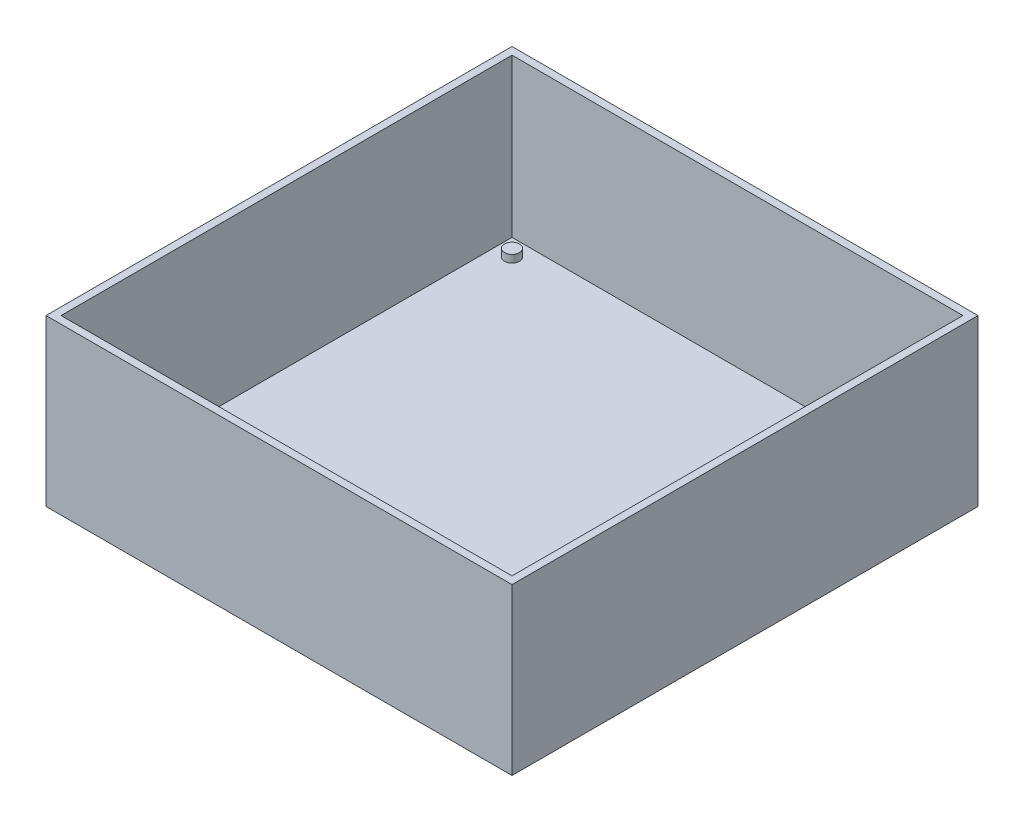
ISO-10303-21;
HEADER;
FILE_DESCRIPTION(('STEP AP214'),'2;1');
FILE_NAME('part.step','',(''),(''),'','','');
FILE_SCHEMA(('AUTOMOTIVE_DESIGN { 1 0 10303 214 1 1 1 1 }'));
ENDSEC;
DATA;
#1=APPLICATION_CONTEXT('core data for automotive mechanical design processes');
#2=APPLICATION_PROTOCOL_DEFINITION('international standard','automotive_design',2000,#1);
#3=PRODUCT_CONTEXT('',#1,'mechanical');
#4=PRODUCT('Part','Part','',(#3));
#5=PRODUCT_RELATED_PRODUCT_CATEGORY('part','',(#4));
#6=PRODUCT_DEFINITION_FORMATION('','',#4);
#7=PRODUCT_DEFINITION_CONTEXT('part definition',#1,'design');
#8=PRODUCT_DEFINITION('design','',#6,#7);
#9=PRODUCT_DEFINITION_SHAPE('','',#8);
#10=(LENGTH_UNIT() NAMED_UNIT(*) SI_UNIT(.MILLI.,.METRE.));
#11=(NAMED_UNIT(*) PLANE_ANGLE_UNIT() SI_UNIT($,.RADIAN.));
#12=(NAMED_UNIT(*) SI_UNIT($,.STERADIAN.) SOLID_ANGLE_UNIT());
#13=UNCERTAINTY_MEASURE_WITH_UNIT(LENGTH_MEASURE(1.E-05),#10,'distance_accuracy_value','');
#14=(GEOMETRIC_REPRESENTATION_CONTEXT(3) GLOBAL_UNCERTAINTY_ASSIGNED_CONTEXT((#13)) GLOBAL_UNIT_ASSIGNED_CONTEXT((#10,
#11,#12)) REPRESENTATION_CONTEXT('',''));
#15=CARTESIAN_POINT('',(0.,0.,0.));
#16=DIRECTION('',(0.,0.,1.));
#17=DIRECTION('',(1.,0.,0.));
#18=AXIS2_PLACEMENT_3D('',#15,#16,#17);
#19=CARTESIAN_POINT('',(0.,2.,0.));
#20=DIRECTION('',(1.,0.,0.));
#21=DIRECTION('',(0.,0.,-1.));
#22=AXIS2_PLACEMENT_3D('',#19,#20,#21);
#23=PLANE('',#22);
#24=DIRECTION('',(0.,0.,1.));
#25=VECTOR('',#24,1.);
#26=CARTESIAN_POINT('',(0.,0.,0.));
#27=LINE('',#26,#25);
#28=CARTESIAN_POINT('',(0.,0.,-124.));
#29=VERTEX_POINT('',#28);
#30=CARTESIAN_POINT('',(0.,0.,0.));
#31=VERTEX_POINT('',#30);
#32=EDGE_CURVE('E152',#29,#31,#27,.T.);
#33=ORIENTED_EDGE('',*,*,#32,.T.);
#34=DIRECTION('',(0.,-1.,0.));
#35=VECTOR('',#34,1.);
#36=CARTESIAN_POINT('',(0.,2.,0.));
#37=LINE('',#36,#35);
#38=CARTESIAN_POINT('',(0.,44.,0.));
#39=VERTEX_POINT('',#38);
#40=EDGE_CURVE('E167',#39,#31,#37,.T.);
#41=ORIENTED_EDGE('',*,*,#40,.F.);
#42=DIRECTION('',(0.,0.,1.));
#43=VECTOR('',#42,1.);
#44=CARTESIAN_POINT('',(0.,44.,0.));
#45=LINE('',#44,#43);
#46=CARTESIAN_POINT('',(0.,44.,-124.));
#47=VERTEX_POINT('',#46);
#48=EDGE_CURVE('E115',#47,#39,#45,.T.);
#49=ORIENTED_EDGE('',*,*,#48,.F.);
#50=DIRECTION('',(0.,-1.,0.));
#51=VECTOR('',#50,1.);
#52=CARTESIAN_POINT('',(0.,2.,-124.));
#53=LINE('',#52,#51);
#54=EDGE_CURVE('E160',#47,#29,#53,.T.);
#55=ORIENTED_EDGE('',*,*,#54,.T.);
#56=EDGE_LOOP('',(#33,#41,#49,#55));
#57=FACE_BOUND('',#56,.T.);
#58=ADVANCED_FACE('F33',(#57),#23,.F.);
#59=CARTESIAN_POINT('',(0.,2.,0.));
#60=DIRECTION('',(0.,0.,-1.));
#61=DIRECTION('',(-1.,0.,0.));
#62=AXIS2_PLACEMENT_3D('',#59,#60,#61);
#63=PLANE('',#62);
#64=DIRECTION('',(1.,0.,0.));
#65=VECTOR('',#64,1.);
#66=CARTESIAN_POINT('',(0.,0.,0.));
#67=LINE('',#66,#65);
#68=CARTESIAN_POINT('',(124.,0.,0.));
#69=VERTEX_POINT('',#68);
#70=EDGE_CURVE('E155',#31,#69,#67,.T.);
#71=ORIENTED_EDGE('',*,*,#70,.T.);
#72=DIRECTION('',(0.,-1.,0.));
#73=VECTOR('',#72,1.);
#74=CARTESIAN_POINT('',(124.,2.,0.));
#75=LINE('',#74,#73);
#76=CARTESIAN_POINT('',(124.,44.,0.));
#77=VERTEX_POINT('',#76);
#78=EDGE_CURVE('E164',#77,#69,#75,.T.);
#79=ORIENTED_EDGE('',*,*,#78,.F.);
#80=DIRECTION('',(1.,0.,0.));
#81=VECTOR('',#80,1.);
#82=CARTESIAN_POINT('',(0.,44.,0.));
#83=LINE('',#82,#81);
#84=EDGE_CURVE('E143',#39,#77,#83,.T.);
#85=ORIENTED_EDGE('',*,*,#84,.F.);
#86=ORIENTED_EDGE('',*,*,#40,.T.);
#87=EDGE_LOOP('',(#71,#79,#85,#86));
#88=FACE_BOUND('',#87,.T.);
#89=ADVANCED_FACE('F203',(#88),#63,.F.);
#90=CARTESIAN_POINT('',(124.,2.,0.));
#91=DIRECTION('',(-1.,0.,0.));
#92=DIRECTION('',(0.,0.,1.));
#93=AXIS2_PLACEMENT_3D('',#90,#91,#92);
#94=PLANE('',#93);
#95=DIRECTION('',(0.,0.,-1.));
#96=VECTOR('',#95,1.);
#97=CARTESIAN_POINT('',(124.,0.,0.));
#98=LINE('',#97,#96);
#99=CARTESIAN_POINT('',(124.,0.,-124.));
#100=VERTEX_POINT('',#99);
#101=EDGE_CURVE('E157',#69,#100,#98,.T.);
#102=ORIENTED_EDGE('',*,*,#101,.T.);
#103=DIRECTION('',(0.,-1.,0.));
#104=VECTOR('',#103,1.);
#105=CARTESIAN_POINT('',(124.,2.,-124.));
#106=LINE('',#105,#104);
#107=CARTESIAN_POINT('',(124.,44.,-124.));
#108=VERTEX_POINT('',#107);
#109=EDGE_CURVE('E162',#108,#100,#106,.T.);
#110=ORIENTED_EDGE('',*,*,#109,.F.);
#111=DIRECTION('',(0.,0.,-1.));
#112=VECTOR('',#111,1.);
#113=CARTESIAN_POINT('',(124.,44.,0.));
#114=LINE('',#113,#112);
#115=EDGE_CURVE('E146',#77,#108,#114,.T.);
#116=ORIENTED_EDGE('',*,*,#115,.F.);
#117=ORIENTED_EDGE('',*,*,#78,.T.);
#118=EDGE_LOOP('',(#102,#110,#116,#117));
#119=FACE_BOUND('',#118,.T.);
#120=ADVANCED_FACE('F208',(#119),#94,.F.);
#121=CARTESIAN_POINT('',(0.,2.,-124.));
#122=DIRECTION('',(0.,0.,1.));
#123=DIRECTION('',(1.,0.,0.));
#124=AXIS2_PLACEMENT_3D('',#121,#122,#123);
#125=PLANE('',#124);
#126=DIRECTION('',(-1.,0.,0.));
#127=VECTOR('',#126,1.);
#128=CARTESIAN_POINT('',(0.,0.,-124.));
#129=LINE('',#128,#127);
#130=EDGE_CURVE('E55',#100,#29,#129,.T.);
#131=ORIENTED_EDGE('',*,*,#130,.T.);
#132=ORIENTED_EDGE('',*,*,#54,.F.);
#133=DIRECTION('',(-1.,0.,0.));
#134=VECTOR('',#133,1.);
#135=CARTESIAN_POINT('',(0.,44.,-124.));
#136=LINE('',#135,#134);
#137=EDGE_CURVE('E149',#108,#47,#136,.T.);
#138=ORIENTED_EDGE('',*,*,#137,.F.);
#139=ORIENTED_EDGE('',*,*,#109,.T.);
#140=EDGE_LOOP('',(#131,#132,#138,#139));
#141=FACE_BOUND('',#140,.T.);
#142=ADVANCED_FACE('F219',(#141),#125,.F.);
#143=CARTESIAN_POINT('',(0.,0.,0.));
#144=DIRECTION('',(0.,-1.,0.));
#145=DIRECTION('',(0.,0.,-1.));
#146=AXIS2_PLACEMENT_3D('',#143,#144,#145);
#147=PLANE('',#146);
#148=ORIENTED_EDGE('',*,*,#32,.F.);
#149=ORIENTED_EDGE('',*,*,#130,.F.);
#150=ORIENTED_EDGE('',*,*,#101,.F.);
#151=ORIENTED_EDGE('',*,*,#70,.F.);
#152=EDGE_LOOP('',(#148,#149,#150,#151));
#153=FACE_BOUND('',#152,.T.);
#154=ADVANCED_FACE('F214',(#153),#147,.T.);
#155=CARTESIAN_POINT('',(0.,44.,0.));
#156=DIRECTION('',(0.,-1.,0.));
#157=DIRECTION('',(0.,0.,-1.));
#158=AXIS2_PLACEMENT_3D('',#155,#156,#157);
#159=PLANE('',#158);
#160=ORIENTED_EDGE('',*,*,#48,.T.);
#161=ORIENTED_EDGE('',*,*,#84,.T.);
#162=ORIENTED_EDGE('',*,*,#115,.T.);
#163=ORIENTED_EDGE('',*,*,#137,.T.);
#164=EDGE_LOOP('',(#160,#161,#162,#163));
#165=FACE_BOUND('',#164,.T.);
#166=DIRECTION('',(0.,0.,1.));
#167=VECTOR('',#166,1.);
#168=CARTESIAN_POINT('',(2.,44.,-2.));
#169=LINE('',#168,#167);
#170=CARTESIAN_POINT('',(2.,44.,-122.));
#171=VERTEX_POINT('',#170);
#172=CARTESIAN_POINT('',(2.,44.,-2.));
#173=VERTEX_POINT('',#172);
#174=EDGE_CURVE('E99',#171,#173,#169,.T.);
#175=ORIENTED_EDGE('',*,*,#174,.F.);
#176=DIRECTION('',(-1.,0.,0.));
#177=VECTOR('',#176,1.);
#178=CARTESIAN_POINT('',(2.,44.,-122.));
#179=LINE('',#178,#177);
#180=CARTESIAN_POINT('',(122.,44.,-122.));
#181=VERTEX_POINT('',#180);
#182=EDGE_CURVE('E123',#181,#171,#179,.T.);
#183=ORIENTED_EDGE('',*,*,#182,.F.);
#184=DIRECTION('',(0.,0.,-1.));
#185=VECTOR('',#184,1.);
#186=CARTESIAN_POINT('',(122.,44.,-2.));
#187=LINE('',#186,#185);
#188=CARTESIAN_POINT('',(122.,44.,-2.));
#189=VERTEX_POINT('',#188);
#190=EDGE_CURVE('E121',#189,#181,#187,.T.);
#191=ORIENTED_EDGE('',*,*,#190,.F.);
#192=DIRECTION('',(1.,0.,0.));
#193=VECTOR('',#192,1.);
#194=CARTESIAN_POINT('',(2.,44.,-2.));
#195=LINE('',#194,#193);
#196=EDGE_CURVE('E107',#173,#189,#195,.T.);
#197=ORIENTED_EDGE('',*,*,#196,.F.);
#198=EDGE_LOOP('',(#175,#183,#191,#197));
#199=FACE_BOUND('',#198,.T.);
#200=ADVANCED_FACE('F119',(#165,#199),#159,.F.);
#201=CARTESIAN_POINT('',(2.,44.,-2.));
#202=DIRECTION('',(1.,0.,0.));
#203=DIRECTION('',(0.,0.,-1.));
#204=AXIS2_PLACEMENT_3D('',#201,#202,#203);
#205=PLANE('',#204);
#206=DIRECTION('',(0.,0.,1.));
#207=VECTOR('',#206,1.);
#208=CARTESIAN_POINT('',(2.,2.,-2.));
#209=LINE('',#208,#207);
#210=CARTESIAN_POINT('',(2.,2.,-122.));
#211=VERTEX_POINT('',#210);
#212=CARTESIAN_POINT('',(2.,2.,-2.));
#213=VERTEX_POINT('',#212);
#214=EDGE_CURVE('E128',#211,#213,#209,.T.);
#215=ORIENTED_EDGE('',*,*,#214,.F.);
#216=DIRECTION('',(0.,-1.,0.));
#217=VECTOR('',#216,1.);
#218=CARTESIAN_POINT('',(2.,44.,-122.));
#219=LINE('',#218,#217);
#220=EDGE_CURVE('E47',#171,#211,#219,.T.);
#221=ORIENTED_EDGE('',*,*,#220,.F.);
#222=ORIENTED_EDGE('',*,*,#174,.T.);
#223=DIRECTION('',(0.,-1.,0.));
#224=VECTOR('',#223,1.);
#225=CARTESIAN_POINT('',(2.,44.,-2.));
#226=LINE('',#225,#224);
#227=EDGE_CURVE('E102',#173,#213,#226,.T.);
#228=ORIENTED_EDGE('',*,*,#227,.T.);
#229=EDGE_LOOP('',(#215,#221,#222,#228));
#230=FACE_BOUND('',#229,.T.);
#231=ADVANCED_FACE('F101',(#230),#205,.T.);
#232=CARTESIAN_POINT('',(2.,44.,-2.));
#233=DIRECTION('',(0.,0.,-1.));
#234=DIRECTION('',(-1.,0.,0.));
#235=AXIS2_PLACEMENT_3D('',#232,#233,#234);
#236=PLANE('',#235);
#237=DIRECTION('',(1.,0.,0.));
#238=VECTOR('',#237,1.);
#239=CARTESIAN_POINT('',(2.,2.,-2.));
#240=LINE('',#239,#238);
#241=CARTESIAN_POINT('',(122.,2.,-2.));
#242=VERTEX_POINT('',#241);
#243=EDGE_CURVE('E114',#213,#242,#240,.T.);
#244=ORIENTED_EDGE('',*,*,#243,.F.);
#245=ORIENTED_EDGE('',*,*,#227,.F.);
#246=ORIENTED_EDGE('',*,*,#196,.T.);
#247=DIRECTION('',(0.,-1.,0.));
#248=VECTOR('',#247,1.);
#249=CARTESIAN_POINT('',(122.,44.,-2.));
#250=LINE('',#249,#248);
#251=EDGE_CURVE('E116',#189,#242,#250,.T.);
#252=ORIENTED_EDGE('',*,*,#251,.T.);
#253=EDGE_LOOP('',(#244,#245,#246,#252));
#254=FACE_BOUND('',#253,.T.);
#255=ADVANCED_FACE('F111',(#254),#236,.T.);
#256=CARTESIAN_POINT('',(122.,44.,-2.));
#257=DIRECTION('',(-1.,0.,0.));
#258=DIRECTION('',(0.,0.,1.));
#259=AXIS2_PLACEMENT_3D('',#256,#257,#258);
#260=PLANE('',#259);
#261=DIRECTION('',(0.,0.,-1.));
#262=VECTOR('',#261,1.);
#263=CARTESIAN_POINT('',(122.,2.,-2.));
#264=LINE('',#263,#262);
#265=CARTESIAN_POINT('',(122.,2.,-122.));
#266=VERTEX_POINT('',#265);
#267=EDGE_CURVE('E132',#242,#266,#264,.T.);
#268=ORIENTED_EDGE('',*,*,#267,.F.);
#269=ORIENTED_EDGE('',*,*,#251,.F.);
#270=ORIENTED_EDGE('',*,*,#190,.T.);
#271=DIRECTION('',(0.,-1.,0.));
#272=VECTOR('',#271,1.);
#273=CARTESIAN_POINT('',(122.,44.,-122.));
#274=LINE('',#273,#272);
#275=EDGE_CURVE('E138',#181,#266,#274,.T.);
#276=ORIENTED_EDGE('',*,*,#275,.T.);
#277=EDGE_LOOP('',(#268,#269,#270,#276));
#278=FACE_BOUND('',#277,.T.);
#279=ADVANCED_FACE('F193',(#278),#260,.T.);
#280=CARTESIAN_POINT('',(2.,44.,-122.));
#281=DIRECTION('',(0.,0.,1.));
#282=DIRECTION('',(1.,0.,0.));
#283=AXIS2_PLACEMENT_3D('',#280,#281,#282);
#284=PLANE('',#283);
#285=DIRECTION('',(-1.,0.,0.));
#286=VECTOR('',#285,1.);
#287=CARTESIAN_POINT('',(2.,2.,-122.));
#288=LINE('',#287,#286);
#289=EDGE_CURVE('E108',#266,#211,#288,.T.);
#290=ORIENTED_EDGE('',*,*,#289,.F.);
#291=ORIENTED_EDGE('',*,*,#275,.F.);
#292=ORIENTED_EDGE('',*,*,#182,.T.);
#293=ORIENTED_EDGE('',*,*,#220,.T.);
#294=EDGE_LOOP('',(#290,#291,#292,#293));
#295=FACE_BOUND('',#294,.T.);
#296=ADVANCED_FACE('F184',(#295),#284,.T.);
#297=CARTESIAN_POINT('',(0.,2.,0.));
#298=DIRECTION('',(0.,-1.,0.));
#299=DIRECTION('',(0.,0.,-1.));
#300=AXIS2_PLACEMENT_3D('',#297,#298,#299);
#301=PLANE('',#300);
#302=CARTESIAN_POINT('',(117.5,2.,-117.5));
#303=DIRECTION('',(0.,-1.,0.));
#304=DIRECTION('',(0.,0.,-1.));
#305=AXIS2_PLACEMENT_3D('',#302,#303,#304);
#306=CIRCLE('',#305,2.);
#307=CARTESIAN_POINT('',(117.5,2.,-119.5));
#308=VERTEX_POINT('',#307);
#309=EDGE_CURVE('E11',#308,#308,#306,.F.);
#310=ORIENTED_EDGE('',*,*,#309,.F.);
#311=EDGE_LOOP('',(#310));
#312=FACE_BOUND('',#311,.T.);
#313=CARTESIAN_POINT('',(6.5,2.,-117.5));
#314=DIRECTION('',(0.,-1.,0.));
#315=DIRECTION('',(0.,0.,-1.));
#316=AXIS2_PLACEMENT_3D('',#313,#314,#315);
#317=CIRCLE('',#316,2.);
#318=CARTESIAN_POINT('',(6.5,2.,-119.5));
#319=VERTEX_POINT('',#318);
#320=EDGE_CURVE('E40',#319,#319,#317,.F.);
#321=ORIENTED_EDGE('',*,*,#320,.F.);
#322=EDGE_LOOP('',(#321));
#323=FACE_BOUND('',#322,.T.);
#324=CARTESIAN_POINT('',(117.5,2.,-6.5));
#325=DIRECTION('',(0.,-1.,0.));
#326=DIRECTION('',(0.,0.,-1.));
#327=AXIS2_PLACEMENT_3D('',#324,#325,#326);
#328=CIRCLE('',#327,2.);
#329=CARTESIAN_POINT('',(117.5,2.,-8.49999999999999));
#330=VERTEX_POINT('',#329);
#331=EDGE_CURVE('E173',#330,#330,#328,.F.);
#332=ORIENTED_EDGE('',*,*,#331,.F.);
#333=EDGE_LOOP('',(#332));
#334=FACE_BOUND('',#333,.T.);
#335=CARTESIAN_POINT('',(6.5,2.,-6.5));
#336=DIRECTION('',(0.,-1.,0.));
#337=DIRECTION('',(0.,0.,-1.));
#338=AXIS2_PLACEMENT_3D('',#335,#336,#337);
#339=CIRCLE('',#338,2.);
#340=CARTESIAN_POINT('',(6.5,2.,-8.5));
#341=VERTEX_POINT('',#340);
#342=EDGE_CURVE('E170',#341,#341,#339,.F.);
#343=ORIENTED_EDGE('',*,*,#342,.F.);
#344=EDGE_LOOP('',(#343));
#345=FACE_BOUND('',#344,.T.);
#346=ORIENTED_EDGE('',*,*,#289,.T.);
#347=ORIENTED_EDGE('',*,*,#214,.T.);
#348=ORIENTED_EDGE('',*,*,#243,.T.);
#349=ORIENTED_EDGE('',*,*,#267,.T.);
#350=EDGE_LOOP('',(#346,#347,#348,#349));
#351=FACE_BOUND('',#350,.T.);
#352=ADVANCED_FACE('F180',(#312,#323,#334,#345,#351),#301,.F.);
#353=CARTESIAN_POINT('',(6.5,4.,-6.5));
#354=DIRECTION('',(0.,-1.,0.));
#355=DIRECTION('',(0.,0.,-1.));
#356=AXIS2_PLACEMENT_3D('',#353,#354,#355);
#357=CYLINDRICAL_SURFACE('',#356,2.);
#358=CARTESIAN_POINT('',(6.5,4.,-6.5));
#359=DIRECTION('',(0.,1.,0.));
#360=DIRECTION('',(0.,0.,1.));
#361=AXIS2_PLACEMENT_3D('',#358,#359,#360);
#362=CIRCLE('',#361,2.);
#363=CARTESIAN_POINT('',(6.5,4.,-4.5));
#364=VERTEX_POINT('',#363);
#365=EDGE_CURVE('E130',#364,#364,#362,.T.);
#366=ORIENTED_EDGE('',*,*,#365,.F.);
#367=EDGE_LOOP('',(#366));
#368=FACE_BOUND('',#367,.T.);
#369=ORIENTED_EDGE('',*,*,#342,.T.);
#370=EDGE_LOOP('',(#369));
#371=FACE_BOUND('',#370,.T.);
#372=ADVANCED_FACE('F183',(#368,#371),#357,.T.);
#373=CARTESIAN_POINT('',(6.5,4.,-6.5));
#374=DIRECTION('',(0.,1.,0.));
#375=DIRECTION('',(0.,0.,1.));
#376=AXIS2_PLACEMENT_3D('',#373,#374,#375);
#377=PLANE('',#376);
#378=ORIENTED_EDGE('',*,*,#365,.T.);
#379=EDGE_LOOP('',(#378));
#380=FACE_BOUND('',#379,.T.);
#381=ADVANCED_FACE('F268',(#380),#377,.T.);
#382=CARTESIAN_POINT('',(117.5,4.,-6.5));
#383=DIRECTION('',(0.,-1.,0.));
#384=DIRECTION('',(0.,0.,-1.));
#385=AXIS2_PLACEMENT_3D('',#382,#383,#384);
#386=CYLINDRICAL_SURFACE('',#385,2.);
#387=CARTESIAN_POINT('',(117.5,4.,-6.5));
#388=DIRECTION('',(0.,1.,0.));
#389=DIRECTION('',(0.,0.,1.));
#390=AXIS2_PLACEMENT_3D('',#387,#388,#389);
#391=CIRCLE('',#390,2.);
#392=CARTESIAN_POINT('',(117.5,4.,-4.5));
#393=VERTEX_POINT('',#392);
#394=EDGE_CURVE('E347',#393,#393,#391,.T.);
#395=ORIENTED_EDGE('',*,*,#394,.F.);
#396=EDGE_LOOP('',(#395));
#397=FACE_BOUND('',#396,.T.);
#398=ORIENTED_EDGE('',*,*,#331,.T.);
#399=EDGE_LOOP('',(#398));
#400=FACE_BOUND('',#399,.T.);
#401=ADVANCED_FACE('F278',(#397,#400),#386,.T.);
#402=CARTESIAN_POINT('',(117.5,4.,-6.5));
#403=DIRECTION('',(0.,1.,0.));
#404=DIRECTION('',(0.,0.,1.));
#405=AXIS2_PLACEMENT_3D('',#402,#403,#404);
#406=PLANE('',#405);
#407=ORIENTED_EDGE('',*,*,#394,.T.);
#408=EDGE_LOOP('',(#407));
#409=FACE_BOUND('',#408,.T.);
#410=ADVANCED_FACE('F288',(#409),#406,.T.);
#411=CARTESIAN_POINT('',(6.5,4.,-117.5));
#412=DIRECTION('',(0.,-1.,0.));
#413=DIRECTION('',(0.,0.,-1.));
#414=AXIS2_PLACEMENT_3D('',#411,#412,#413);
#415=CYLINDRICAL_SURFACE('',#414,2.);
#416=CARTESIAN_POINT('',(6.5,4.,-117.5));
#417=DIRECTION('',(0.,1.,0.));
#418=DIRECTION('',(0.,0.,1.));
#419=AXIS2_PLACEMENT_3D('',#416,#417,#418);
#420=CIRCLE('',#419,2.);
#421=CARTESIAN_POINT('',(6.5,4.,-115.5));
#422=VERTEX_POINT('',#421);
#423=EDGE_CURVE('E344',#422,#422,#420,.T.);
#424=ORIENTED_EDGE('',*,*,#423,.F.);
#425=EDGE_LOOP('',(#424));
#426=FACE_BOUND('',#425,.T.);
#427=ORIENTED_EDGE('',*,*,#320,.T.);
#428=EDGE_LOOP('',(#427));
#429=FACE_BOUND('',#428,.T.);
#430=ADVANCED_FACE('F178',(#426,#429),#415,.T.);
#431=CARTESIAN_POINT('',(6.5,4.,-117.5));
#432=DIRECTION('',(0.,1.,0.));
#433=DIRECTION('',(0.,0.,1.));
#434=AXIS2_PLACEMENT_3D('',#431,#432,#433);
#435=PLANE('',#434);
#436=ORIENTED_EDGE('',*,*,#423,.T.);
#437=EDGE_LOOP('',(#436));
#438=FACE_BOUND('',#437,.T.);
#439=ADVANCED_FACE('F307',(#438),#435,.T.);
#440=CARTESIAN_POINT('',(117.5,4.,-117.5));
#441=DIRECTION('',(0.,-1.,0.));
#442=DIRECTION('',(0.,0.,-1.));
#443=AXIS2_PLACEMENT_3D('',#440,#441,#442);
#444=CYLINDRICAL_SURFACE('',#443,2.);
#445=CARTESIAN_POINT('',(117.5,4.,-117.5));
#446=DIRECTION('',(0.,1.,0.));
#447=DIRECTION('',(0.,0.,1.));
#448=AXIS2_PLACEMENT_3D('',#445,#446,#447);
#449=CIRCLE('',#448,2.);
#450=CARTESIAN_POINT('',(117.5,4.,-115.5));
#451=VERTEX_POINT('',#450);
#452=EDGE_CURVE('E343',#451,#451,#449,.T.);
#453=ORIENTED_EDGE('',*,*,#452,.F.);
#454=EDGE_LOOP('',(#453));
#455=FACE_BOUND('',#454,.T.);
#456=ORIENTED_EDGE('',*,*,#309,.T.);
#457=EDGE_LOOP('',(#456));
#458=FACE_BOUND('',#457,.T.);
#459=ADVANCED_FACE('F317',(#455,#458),#444,.T.);
#460=CARTESIAN_POINT('',(117.5,4.,-117.5));
#461=DIRECTION('',(0.,1.,0.));
#462=DIRECTION('',(0.,0.,1.));
#463=AXIS2_PLACEMENT_3D('',#460,#461,#462);
#464=PLANE('',#463);
#465=ORIENTED_EDGE('',*,*,#452,.T.);
#466=EDGE_LOOP('',(#465));
#467=FACE_BOUND('',#466,.T.);
#468=ADVANCED_FACE('F327',(#467),#464,.T.);
#469=CLOSED_SHELL('',(#58,#89,#120,#142,#154,#200,#231,#255,#279,#296,#352,#372,#381,#401,#410,
#430,#439,#459,#468));
#470=MANIFOLD_SOLID_BREP('B2',#469);
#471=ADVANCED_BREP_SHAPE_REPRESENTATION('',(#18,#470),#14);
#472=SHAPE_DEFINITION_REPRESENTATION(#9,#471);
ENDSEC;
END-ISO-10303-21;
